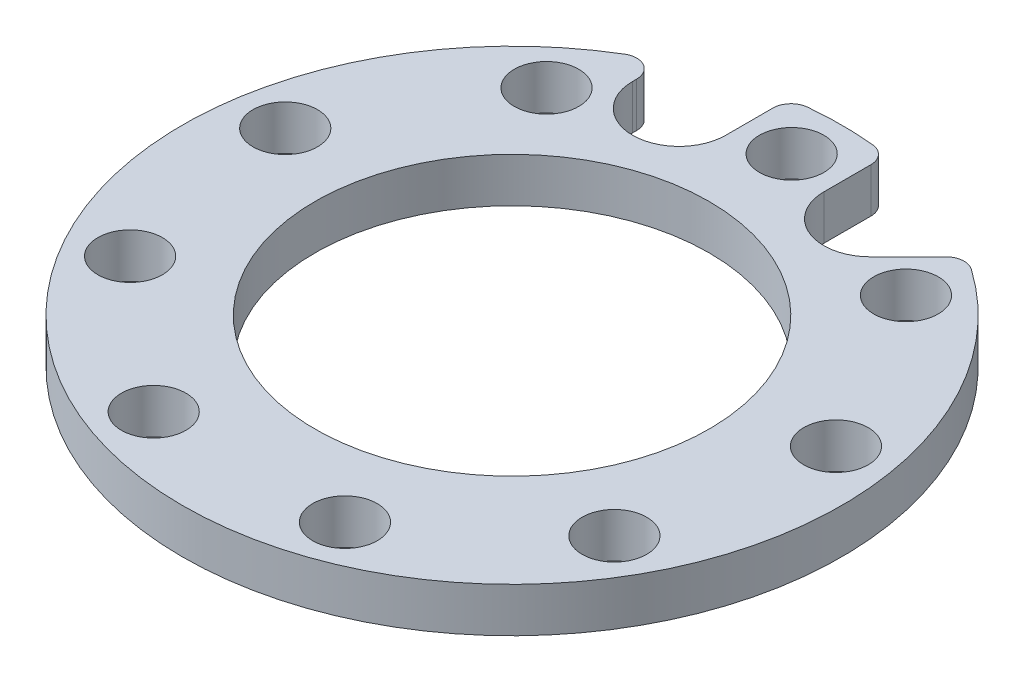
ISO-10303-21;
HEADER;
FILE_DESCRIPTION(('STEP AP214'),'2;1');
FILE_NAME('part.step','',(''),(''),'','','');
FILE_SCHEMA(('AUTOMOTIVE_DESIGN { 1 0 10303 214 1 1 1 1 }'));
ENDSEC;
DATA;
#1=APPLICATION_CONTEXT('core data for automotive mechanical design processes');
#2=APPLICATION_PROTOCOL_DEFINITION('international standard','automotive_design',2000,#1);
#3=PRODUCT_CONTEXT('',#1,'mechanical');
#4=PRODUCT('Part','Part','',(#3));
#5=PRODUCT_RELATED_PRODUCT_CATEGORY('part','',(#4));
#6=PRODUCT_DEFINITION_FORMATION('','',#4);
#7=PRODUCT_DEFINITION_CONTEXT('part definition',#1,'design');
#8=PRODUCT_DEFINITION('design','',#6,#7);
#9=PRODUCT_DEFINITION_SHAPE('','',#8);
#10=(LENGTH_UNIT() NAMED_UNIT(*) SI_UNIT(.MILLI.,.METRE.));
#11=(NAMED_UNIT(*) PLANE_ANGLE_UNIT() SI_UNIT($,.RADIAN.));
#12=(NAMED_UNIT(*) SI_UNIT($,.STERADIAN.) SOLID_ANGLE_UNIT());
#13=UNCERTAINTY_MEASURE_WITH_UNIT(LENGTH_MEASURE(1.E-05),#10,'distance_accuracy_value','');
#14=(GEOMETRIC_REPRESENTATION_CONTEXT(3) GLOBAL_UNCERTAINTY_ASSIGNED_CONTEXT((#13)) GLOBAL_UNIT_ASSIGNED_CONTEXT((#10,
#11,#12)) REPRESENTATION_CONTEXT('',''));
#15=CARTESIAN_POINT('',(0.,0.,0.));
#16=DIRECTION('',(0.,0.,1.));
#17=DIRECTION('',(1.,0.,0.));
#18=AXIS2_PLACEMENT_3D('',#15,#16,#17);
#19=CARTESIAN_POINT('',(0.,6.21400078,0.));
#20=DIRECTION('',(0.,-1.,0.));
#21=DIRECTION('',(0.,0.,-1.));
#22=AXIS2_PLACEMENT_3D('',#19,#20,#21);
#23=CYLINDRICAL_SURFACE('',#22,45.974);
#24=CARTESIAN_POINT('',(0.,6.21400078,0.));
#25=DIRECTION('',(0.,1.,0.));
#26=DIRECTION('',(0.,0.,1.));
#27=AXIS2_PLACEMENT_3D('',#24,#25,#26);
#28=CIRCLE('',#27,45.974);
#29=CARTESIAN_POINT('',(4.55017655985906,6.21400078,-45.7482739485777));
#30=VERTEX_POINT('',#29);
#31=CARTESIAN_POINT('',(-4.55017655985855,6.21400078,-45.7482739485777));
#32=VERTEX_POINT('',#31);
#33=EDGE_CURVE('E195',#30,#32,#28,.T.);
#34=ORIENTED_EDGE('',*,*,#33,.F.);
#35=DIRECTION('',(0.,-1.,0.));
#36=VECTOR('',#35,1.);
#37=CARTESIAN_POINT('',(4.55017655985906,6.21400078,-45.7482739485777));
#38=LINE('',#37,#36);
#39=CARTESIAN_POINT('',(4.55017655985906,0.,-45.7482739485777));
#40=VERTEX_POINT('',#39);
#41=EDGE_CURVE('E243',#30,#40,#38,.T.);
#42=ORIENTED_EDGE('',*,*,#41,.T.);
#43=CARTESIAN_POINT('',(0.,0.,0.));
#44=DIRECTION('',(0.,1.,0.));
#45=DIRECTION('',(0.,0.,1.));
#46=AXIS2_PLACEMENT_3D('',#43,#44,#45);
#47=CIRCLE('',#46,45.974);
#48=CARTESIAN_POINT('',(-4.55017655985855,0.,-45.7482739485777));
#49=VERTEX_POINT('',#48);
#50=EDGE_CURVE('E201',#40,#49,#47,.T.);
#51=ORIENTED_EDGE('',*,*,#50,.T.);
#52=DIRECTION('',(0.,-1.,0.));
#53=VECTOR('',#52,1.);
#54=CARTESIAN_POINT('',(-4.55017655985855,6.21400078,-45.7482739485777));
#55=LINE('',#54,#53);
#56=EDGE_CURVE('E239',#49,#32,#55,.F.);
#57=ORIENTED_EDGE('',*,*,#56,.T.);
#58=EDGE_LOOP('',(#34,#42,#51,#57));
#59=FACE_BOUND('',#58,.T.);
#60=ADVANCED_FACE('F47',(#59),#23,.T.);
#61=CARTESIAN_POINT('',(0.,6.21400078,0.));
#62=DIRECTION('',(0.,1.,0.));
#63=DIRECTION('',(0.,0.,1.));
#64=AXIS2_PLACEMENT_3D('',#61,#62,#63);
#65=PLANE('',#64);
#66=CARTESIAN_POINT('',(-23.687486501379,6.21400078,-39.401924562729));
#67=VERTEX_POINT('',#66);
#68=CARTESIAN_POINT('',(26.4576638960307,6.21400078,-37.5978815515539));
#69=VERTEX_POINT('',#68);
#70=EDGE_CURVE('E200',#67,#69,#28,.T.);
#71=ORIENTED_EDGE('',*,*,#70,.T.);
#72=CARTESIAN_POINT('',(24.9959145095096,6.21400078,-35.5206505266061));
#73=DIRECTION('',(0.,1.,0.));
#74=DIRECTION('',(0.,0.,1.));
#75=AXIS2_PLACEMENT_3D('',#72,#73,#74);
#76=CIRCLE('',#75,2.54);
#77=CARTESIAN_POINT('',(23.1998632852958,6.21400078,-37.31670175082));
#78=VERTEX_POINT('',#77);
#79=EDGE_CURVE('E220',#69,#78,#76,.T.);
#80=ORIENTED_EDGE('',*,*,#79,.T.);
#81=DIRECTION('',(0.707106781186547,0.,-0.707106781186548));
#82=VECTOR('',#81,1.);
#83=CARTESIAN_POINT('',(17.9349796674137,6.21400078,-32.0518181329379));
#84=LINE('',#83,#82);
#85=CARTESIAN_POINT('',(17.9349796674137,6.21400078,-32.0518181329379));
#86=VERTEX_POINT('',#85);
#87=EDGE_CURVE('E289',#86,#78,#84,.T.);
#88=ORIENTED_EDGE('',*,*,#87,.F.);
#89=CARTESIAN_POINT('',(13.3387855897011,6.21400078,-36.6480122106504));
#90=DIRECTION('',(0.,1.,0.));
#91=DIRECTION('',(0.,0.,1.));
#92=AXIS2_PLACEMENT_3D('',#89,#90,#91);
#93=CIRCLE('',#92,6.5);
#94=CARTESIAN_POINT('',(6.83878558970111,6.21400078,-36.6480122106504));
#95=VERTEX_POINT('',#94);
#96=EDGE_CURVE('E167',#95,#86,#93,.T.);
#97=ORIENTED_EDGE('',*,*,#96,.F.);
#98=DIRECTION('',(0.,0.,1.));
#99=VECTOR('',#98,1.);
#100=CARTESIAN_POINT('',(6.83878558970111,6.21400078,-36.6480122106504));
#101=LINE('',#100,#99);
#102=CARTESIAN_POINT('',(6.83878558970111,6.21400078,-43.2207450011424));
#103=VERTEX_POINT('',#102);
#104=EDGE_CURVE('E157',#103,#95,#101,.T.);
#105=ORIENTED_EDGE('',*,*,#104,.F.);
#106=CARTESIAN_POINT('',(4.2987855897011,6.21400078,-43.2207450011424));
#107=DIRECTION('',(0.,1.,0.));
#108=DIRECTION('',(0.,0.,1.));
#109=AXIS2_PLACEMENT_3D('',#106,#107,#108);
#110=CIRCLE('',#109,2.54);
#111=EDGE_CURVE('E217',#103,#30,#110,.T.);
#112=ORIENTED_EDGE('',*,*,#111,.T.);
#113=ORIENTED_EDGE('',*,*,#33,.T.);
#114=CARTESIAN_POINT('',(-4.29878558970062,6.21400078,-43.2207450011425));
#115=DIRECTION('',(0.,1.,0.));
#116=DIRECTION('',(0.,0.,1.));
#117=AXIS2_PLACEMENT_3D('',#114,#115,#116);
#118=CIRCLE('',#117,2.54);
#119=CARTESIAN_POINT('',(-6.83878558970062,6.21400078,-43.2207450011425));
#120=VERTEX_POINT('',#119);
#121=EDGE_CURVE('E214',#32,#120,#118,.T.);
#122=ORIENTED_EDGE('',*,*,#121,.T.);
#123=DIRECTION('',(0.,0.,-1.));
#124=VECTOR('',#123,1.);
#125=CARTESIAN_POINT('',(-6.83878558970062,6.21400078,-36.6480122106506));
#126=LINE('',#125,#124);
#127=CARTESIAN_POINT('',(-6.83878558970062,6.21400078,-36.6480122106506));
#128=VERTEX_POINT('',#127);
#129=EDGE_CURVE('E313',#128,#120,#126,.T.);
#130=ORIENTED_EDGE('',*,*,#129,.F.);
#131=CARTESIAN_POINT('',(-13.3387855897006,6.21400078,-36.6480122106506));
#132=DIRECTION('',(0.,1.,0.));
#133=DIRECTION('',(0.,0.,1.));
#134=AXIS2_PLACEMENT_3D('',#131,#132,#133);
#135=CIRCLE('',#134,6.5);
#136=CARTESIAN_POINT('',(-19.8387855897006,6.21400078,-36.6480122106506));
#137=VERTEX_POINT('',#136);
#138=EDGE_CURVE('E179',#137,#128,#135,.T.);
#139=ORIENTED_EDGE('',*,*,#138,.F.);
#140=DIRECTION('',(0.,0.,1.));
#141=VECTOR('',#140,1.);
#142=CARTESIAN_POINT('',(-19.8387855897006,6.21400078,-36.6480122106506));
#143=LINE('',#142,#141);
#144=CARTESIAN_POINT('',(-19.8387855897006,6.21400078,-37.225022653186));
#145=VERTEX_POINT('',#144);
#146=EDGE_CURVE('E310',#145,#137,#143,.T.);
#147=ORIENTED_EDGE('',*,*,#146,.F.);
#148=CARTESIAN_POINT('',(-22.3787855897006,6.21400078,-37.225022653186));
#149=DIRECTION('',(0.,1.,0.));
#150=DIRECTION('',(0.,0.,1.));
#151=AXIS2_PLACEMENT_3D('',#148,#149,#150);
#152=CIRCLE('',#151,2.54);
#153=EDGE_CURVE('E211',#145,#67,#152,.T.);
#154=ORIENTED_EDGE('',*,*,#153,.T.);
#155=EDGE_LOOP('',(#71,#80,#88,#97,#105,#112,#113,#122,#130,#139,#147,#154));
#156=FACE_BOUND('',#155,.T.);
#157=CARTESIAN_POINT('',(-25.0687167777747,6.21400078,-29.8757332816405));
#158=DIRECTION('',(0.,1.,0.));
#159=DIRECTION('',(0.,0.,1.));
#160=AXIS2_PLACEMENT_3D('',#157,#158,#159);
#161=CIRCLE('',#160,4.49999999999999);
#162=CARTESIAN_POINT('',(-25.0687167777747,6.21400078,-25.3757332816405));
#163=VERTEX_POINT('',#162);
#164=EDGE_CURVE('E162',#163,#163,#161,.T.);
#165=ORIENTED_EDGE('',*,*,#164,.F.);
#166=EDGE_LOOP('',(#165));
#167=FACE_BOUND('',#166,.T.);
#168=CARTESIAN_POINT('',(-38.407502367476,6.21400078,-6.77227892901068));
#169=DIRECTION('',(0.,1.,0.));
#170=DIRECTION('',(0.,0.,1.));
#171=AXIS2_PLACEMENT_3D('',#168,#169,#170);
#172=CIRCLE('',#171,4.49999999999999);
#173=CARTESIAN_POINT('',(-38.407502367476,6.21400078,-2.27227892901069));
#174=VERTEX_POINT('',#173);
#175=EDGE_CURVE('E327',#174,#174,#172,.T.);
#176=ORIENTED_EDGE('',*,*,#175,.F.);
#177=EDGE_LOOP('',(#176));
#178=FACE_BOUND('',#177,.T.);
#179=CARTESIAN_POINT('',(-33.7749907475933,6.21400078,19.4999999999997));
#180=DIRECTION('',(0.,1.,0.));
#181=DIRECTION('',(0.,0.,1.));
#182=AXIS2_PLACEMENT_3D('',#179,#180,#181);
#183=CIRCLE('',#182,4.49999999999999);
#184=CARTESIAN_POINT('',(-33.7749907475933,6.21400078,23.9999999999997));
#185=VERTEX_POINT('',#184);
#186=EDGE_CURVE('E335',#185,#185,#183,.T.);
#187=ORIENTED_EDGE('',*,*,#186,.F.);
#188=EDGE_LOOP('',(#187));
#189=FACE_BOUND('',#188,.T.);
#190=CARTESIAN_POINT('',(-13.3387855897014,6.21400078,36.6480122106503));
#191=DIRECTION('',(0.,1.,0.));
#192=DIRECTION('',(0.,0.,1.));
#193=AXIS2_PLACEMENT_3D('',#190,#191,#192);
#194=CIRCLE('',#193,4.49999999999999);
#195=CARTESIAN_POINT('',(-13.3387855897014,6.21400078,41.1480122106503));
#196=VERTEX_POINT('',#195);
#197=EDGE_CURVE('E343',#196,#196,#194,.T.);
#198=ORIENTED_EDGE('',*,*,#197,.F.);
#199=EDGE_LOOP('',(#198));
#200=FACE_BOUND('',#199,.T.);
#201=CARTESIAN_POINT('',(13.3387855897009,6.21400078,36.6480122106505));
#202=DIRECTION('',(0.,1.,0.));
#203=DIRECTION('',(0.,0.,1.));
#204=AXIS2_PLACEMENT_3D('',#201,#202,#203);
#205=CIRCLE('',#204,4.49999999999999);
#206=CARTESIAN_POINT('',(13.3387855897009,6.21400078,41.1480122106505));
#207=VERTEX_POINT('',#206);
#208=EDGE_CURVE('E351',#207,#207,#205,.T.);
#209=ORIENTED_EDGE('',*,*,#208,.F.);
#210=EDGE_LOOP('',(#209));
#211=FACE_BOUND('',#210,.T.);
#212=CARTESIAN_POINT('',(33.774990747593,6.21400078,19.5000000000002));
#213=DIRECTION('',(0.,1.,0.));
#214=DIRECTION('',(0.,0.,1.));
#215=AXIS2_PLACEMENT_3D('',#212,#213,#214);
#216=CIRCLE('',#215,4.49999999999999);
#217=CARTESIAN_POINT('',(33.774990747593,6.21400078,24.0000000000001));
#218=VERTEX_POINT('',#217);
#219=EDGE_CURVE('E359',#218,#218,#216,.T.);
#220=ORIENTED_EDGE('',*,*,#219,.F.);
#221=EDGE_LOOP('',(#220));
#222=FACE_BOUND('',#221,.T.);
#223=CARTESIAN_POINT('',(38.4075023674761,6.21400078,-6.77227892901017));
#224=DIRECTION('',(0.,1.,0.));
#225=DIRECTION('',(0.,0.,1.));
#226=AXIS2_PLACEMENT_3D('',#223,#224,#225);
#227=CIRCLE('',#226,4.49999999999999);
#228=CARTESIAN_POINT('',(38.4075023674761,6.21400078,-2.27227892901018));
#229=VERTEX_POINT('',#228);
#230=EDGE_CURVE('E367',#229,#229,#227,.T.);
#231=ORIENTED_EDGE('',*,*,#230,.F.);
#232=EDGE_LOOP('',(#231));
#233=FACE_BOUND('',#232,.T.);
#234=CARTESIAN_POINT('',(25.0687167777751,6.21400078,-29.8757332816401));
#235=DIRECTION('',(0.,1.,0.));
#236=DIRECTION('',(0.,0.,1.));
#237=AXIS2_PLACEMENT_3D('',#234,#235,#236);
#238=CIRCLE('',#237,4.49999999999999);
#239=CARTESIAN_POINT('',(25.0687167777751,6.21400078,-25.3757332816401));
#240=VERTEX_POINT('',#239);
#241=EDGE_CURVE('E375',#240,#240,#238,.T.);
#242=ORIENTED_EDGE('',*,*,#241,.F.);
#243=EDGE_LOOP('',(#242));
#244=FACE_BOUND('',#243,.T.);
#245=CARTESIAN_POINT('',(0.,6.21400078,-39.));
#246=DIRECTION('',(0.,1.,0.));
#247=DIRECTION('',(0.,0.,1.));
#248=AXIS2_PLACEMENT_3D('',#245,#246,#247);
#249=CIRCLE('',#248,4.49999999999999);
#250=CARTESIAN_POINT('',(0.,6.21400078,-34.5));
#251=VERTEX_POINT('',#250);
#252=EDGE_CURVE('E176',#251,#251,#249,.T.);
#253=ORIENTED_EDGE('',*,*,#252,.F.);
#254=EDGE_LOOP('',(#253));
#255=FACE_BOUND('',#254,.T.);
#256=CARTESIAN_POINT('',(0.,6.21400078,0.));
#257=DIRECTION('',(0.,1.,0.));
#258=DIRECTION('',(0.,0.,1.));
#259=AXIS2_PLACEMENT_3D('',#256,#257,#258);
#260=CIRCLE('',#259,27.4955);
#261=CARTESIAN_POINT('',(0.,6.21400078,-27.4955));
#262=VERTEX_POINT('',#261);
#263=EDGE_CURVE('E187',#262,#262,#260,.T.);
#264=ORIENTED_EDGE('',*,*,#263,.F.);
#265=EDGE_LOOP('',(#264));
#266=FACE_BOUND('',#265,.T.);
#267=ADVANCED_FACE('F287',(#156,#167,#178,#189,#200,#211,#222,#233,#244,#255,#266),#65,.T.);
#268=CARTESIAN_POINT('',(0.,0.,0.));
#269=DIRECTION('',(0.,1.,0.));
#270=DIRECTION('',(0.,0.,1.));
#271=AXIS2_PLACEMENT_3D('',#268,#269,#270);
#272=PLANE('',#271);
#273=CARTESIAN_POINT('',(-25.0687167777747,0.,-29.8757332816405));
#274=DIRECTION('',(0.,1.,0.));
#275=DIRECTION('',(0.,0.,1.));
#276=AXIS2_PLACEMENT_3D('',#273,#274,#275);
#277=CIRCLE('',#276,4.5);
#278=CARTESIAN_POINT('',(-25.0687167777747,0.,-25.3757332816405));
#279=VERTEX_POINT('',#278);
#280=EDGE_CURVE('E323',#279,#279,#277,.T.);
#281=ORIENTED_EDGE('',*,*,#280,.T.);
#282=EDGE_LOOP('',(#281));
#283=FACE_BOUND('',#282,.T.);
#284=CARTESIAN_POINT('',(-38.407502367476,0.,-6.77227892901068));
#285=DIRECTION('',(0.,1.,0.));
#286=DIRECTION('',(0.,0.,1.));
#287=AXIS2_PLACEMENT_3D('',#284,#285,#286);
#288=CIRCLE('',#287,4.5);
#289=CARTESIAN_POINT('',(-38.407502367476,0.,-2.27227892901068));
#290=VERTEX_POINT('',#289);
#291=EDGE_CURVE('E331',#290,#290,#288,.T.);
#292=ORIENTED_EDGE('',*,*,#291,.T.);
#293=EDGE_LOOP('',(#292));
#294=FACE_BOUND('',#293,.T.);
#295=CARTESIAN_POINT('',(-33.7749907475933,0.,19.4999999999997));
#296=DIRECTION('',(0.,1.,0.));
#297=DIRECTION('',(0.,0.,1.));
#298=AXIS2_PLACEMENT_3D('',#295,#296,#297);
#299=CIRCLE('',#298,4.5);
#300=CARTESIAN_POINT('',(-33.7749907475933,0.,23.9999999999997));
#301=VERTEX_POINT('',#300);
#302=EDGE_CURVE('E339',#301,#301,#299,.T.);
#303=ORIENTED_EDGE('',*,*,#302,.T.);
#304=EDGE_LOOP('',(#303));
#305=FACE_BOUND('',#304,.T.);
#306=CARTESIAN_POINT('',(-13.3387855897014,0.,36.6480122106503));
#307=DIRECTION('',(0.,1.,0.));
#308=DIRECTION('',(0.,0.,1.));
#309=AXIS2_PLACEMENT_3D('',#306,#307,#308);
#310=CIRCLE('',#309,4.5);
#311=CARTESIAN_POINT('',(-13.3387855897014,0.,41.1480122106503));
#312=VERTEX_POINT('',#311);
#313=EDGE_CURVE('E347',#312,#312,#310,.T.);
#314=ORIENTED_EDGE('',*,*,#313,.T.);
#315=EDGE_LOOP('',(#314));
#316=FACE_BOUND('',#315,.T.);
#317=CARTESIAN_POINT('',(13.3387855897009,0.,36.6480122106505));
#318=DIRECTION('',(0.,1.,0.));
#319=DIRECTION('',(0.,0.,1.));
#320=AXIS2_PLACEMENT_3D('',#317,#318,#319);
#321=CIRCLE('',#320,4.5);
#322=CARTESIAN_POINT('',(13.3387855897009,0.,41.1480122106505));
#323=VERTEX_POINT('',#322);
#324=EDGE_CURVE('E355',#323,#323,#321,.T.);
#325=ORIENTED_EDGE('',*,*,#324,.T.);
#326=EDGE_LOOP('',(#325));
#327=FACE_BOUND('',#326,.T.);
#328=CARTESIAN_POINT('',(33.774990747593,0.,19.5000000000002));
#329=DIRECTION('',(0.,1.,0.));
#330=DIRECTION('',(0.,0.,1.));
#331=AXIS2_PLACEMENT_3D('',#328,#329,#330);
#332=CIRCLE('',#331,4.5);
#333=CARTESIAN_POINT('',(33.774990747593,0.,24.0000000000002));
#334=VERTEX_POINT('',#333);
#335=EDGE_CURVE('E363',#334,#334,#332,.T.);
#336=ORIENTED_EDGE('',*,*,#335,.T.);
#337=EDGE_LOOP('',(#336));
#338=FACE_BOUND('',#337,.T.);
#339=CARTESIAN_POINT('',(38.4075023674761,0.,-6.77227892901017));
#340=DIRECTION('',(0.,1.,0.));
#341=DIRECTION('',(0.,0.,1.));
#342=AXIS2_PLACEMENT_3D('',#339,#340,#341);
#343=CIRCLE('',#342,4.5);
#344=CARTESIAN_POINT('',(38.4075023674761,0.,-2.27227892901017));
#345=VERTEX_POINT('',#344);
#346=EDGE_CURVE('E371',#345,#345,#343,.T.);
#347=ORIENTED_EDGE('',*,*,#346,.T.);
#348=EDGE_LOOP('',(#347));
#349=FACE_BOUND('',#348,.T.);
#350=CARTESIAN_POINT('',(25.0687167777751,0.,-29.8757332816401));
#351=DIRECTION('',(0.,1.,0.));
#352=DIRECTION('',(0.,0.,1.));
#353=AXIS2_PLACEMENT_3D('',#350,#351,#352);
#354=CIRCLE('',#353,4.5);
#355=CARTESIAN_POINT('',(25.0687167777751,0.,-25.3757332816401));
#356=VERTEX_POINT('',#355);
#357=EDGE_CURVE('E379',#356,#356,#354,.T.);
#358=ORIENTED_EDGE('',*,*,#357,.T.);
#359=EDGE_LOOP('',(#358));
#360=FACE_BOUND('',#359,.T.);
#361=CARTESIAN_POINT('',(0.,0.,-39.));
#362=DIRECTION('',(0.,1.,0.));
#363=DIRECTION('',(0.,0.,1.));
#364=AXIS2_PLACEMENT_3D('',#361,#362,#363);
#365=CIRCLE('',#364,4.5);
#366=CARTESIAN_POINT('',(0.,0.,-34.5));
#367=VERTEX_POINT('',#366);
#368=EDGE_CURVE('E168',#367,#367,#365,.T.);
#369=ORIENTED_EDGE('',*,*,#368,.T.);
#370=EDGE_LOOP('',(#369));
#371=FACE_BOUND('',#370,.T.);
#372=CARTESIAN_POINT('',(0.,0.,0.));
#373=DIRECTION('',(0.,1.,0.));
#374=DIRECTION('',(0.,0.,1.));
#375=AXIS2_PLACEMENT_3D('',#372,#373,#374);
#376=CIRCLE('',#375,27.4955);
#377=CARTESIAN_POINT('',(0.,0.,-27.4955));
#378=VERTEX_POINT('',#377);
#379=EDGE_CURVE('E183',#378,#378,#376,.T.);
#380=ORIENTED_EDGE('',*,*,#379,.T.);
#381=EDGE_LOOP('',(#380));
#382=FACE_BOUND('',#381,.T.);
#383=DIRECTION('',(0.707106781186547,0.,-0.707106781186548));
#384=VECTOR('',#383,1.);
#385=CARTESIAN_POINT('',(17.9349796674137,0.,-32.0518181329379));
#386=LINE('',#385,#384);
#387=CARTESIAN_POINT('',(17.9349796674137,0.,-32.0518181329379));
#388=VERTEX_POINT('',#387);
#389=CARTESIAN_POINT('',(23.1998632852958,0.,-37.31670175082));
#390=VERTEX_POINT('',#389);
#391=EDGE_CURVE('E151',#388,#390,#386,.T.);
#392=ORIENTED_EDGE('',*,*,#391,.T.);
#393=CARTESIAN_POINT('',(24.9959145095096,0.,-35.5206505266061));
#394=DIRECTION('',(0.,1.,0.));
#395=DIRECTION('',(0.,0.,1.));
#396=AXIS2_PLACEMENT_3D('',#393,#394,#395);
#397=CIRCLE('',#396,2.54);
#398=CARTESIAN_POINT('',(26.4576638960307,0.,-37.5978815515539));
#399=VERTEX_POINT('',#398);
#400=EDGE_CURVE('E233',#390,#399,#397,.F.);
#401=ORIENTED_EDGE('',*,*,#400,.T.);
#402=CARTESIAN_POINT('',(-23.687486501379,0.,-39.401924562729));
#403=VERTEX_POINT('',#402);
#404=EDGE_CURVE('E191',#403,#399,#47,.T.);
#405=ORIENTED_EDGE('',*,*,#404,.F.);
#406=CARTESIAN_POINT('',(-22.3787855897006,0.,-37.225022653186));
#407=DIRECTION('',(0.,1.,0.));
#408=DIRECTION('',(0.,0.,1.));
#409=AXIS2_PLACEMENT_3D('',#406,#407,#408);
#410=CIRCLE('',#409,2.54);
#411=CARTESIAN_POINT('',(-19.8387855897006,0.,-37.225022653186));
#412=VERTEX_POINT('',#411);
#413=EDGE_CURVE('E70',#403,#412,#410,.F.);
#414=ORIENTED_EDGE('',*,*,#413,.T.);
#415=DIRECTION('',(0.,0.,1.));
#416=VECTOR('',#415,1.);
#417=CARTESIAN_POINT('',(-19.8387855897006,0.,-36.6480122106506));
#418=LINE('',#417,#416);
#419=CARTESIAN_POINT('',(-19.8387855897006,0.,-36.6480122106506));
#420=VERTEX_POINT('',#419);
#421=EDGE_CURVE('E309',#412,#420,#418,.T.);
#422=ORIENTED_EDGE('',*,*,#421,.T.);
#423=CARTESIAN_POINT('',(-13.3387855897006,0.,-36.6480122106506));
#424=DIRECTION('',(0.,1.,0.));
#425=DIRECTION('',(0.,0.,1.));
#426=AXIS2_PLACEMENT_3D('',#423,#424,#425);
#427=CIRCLE('',#426,6.5);
#428=CARTESIAN_POINT('',(-6.83878558970062,0.,-36.6480122106506));
#429=VERTEX_POINT('',#428);
#430=EDGE_CURVE('E173',#420,#429,#427,.T.);
#431=ORIENTED_EDGE('',*,*,#430,.T.);
#432=DIRECTION('',(0.,0.,-1.));
#433=VECTOR('',#432,1.);
#434=CARTESIAN_POINT('',(-6.83878558970062,0.,-36.6480122106506));
#435=LINE('',#434,#433);
#436=CARTESIAN_POINT('',(-6.83878558970062,0.,-43.2207450011425));
#437=VERTEX_POINT('',#436);
#438=EDGE_CURVE('E306',#429,#437,#435,.T.);
#439=ORIENTED_EDGE('',*,*,#438,.T.);
#440=CARTESIAN_POINT('',(-4.29878558970062,0.,-43.2207450011425));
#441=DIRECTION('',(0.,1.,0.));
#442=DIRECTION('',(0.,0.,1.));
#443=AXIS2_PLACEMENT_3D('',#440,#441,#442);
#444=CIRCLE('',#443,2.54);
#445=EDGE_CURVE('E228',#437,#49,#444,.F.);
#446=ORIENTED_EDGE('',*,*,#445,.T.);
#447=ORIENTED_EDGE('',*,*,#50,.F.);
#448=CARTESIAN_POINT('',(4.2987855897011,0.,-43.2207450011424));
#449=DIRECTION('',(0.,1.,0.));
#450=DIRECTION('',(0.,0.,1.));
#451=AXIS2_PLACEMENT_3D('',#448,#449,#450);
#452=CIRCLE('',#451,2.54);
#453=CARTESIAN_POINT('',(6.83878558970111,0.,-43.2207450011424));
#454=VERTEX_POINT('',#453);
#455=EDGE_CURVE('E145',#40,#454,#452,.F.);
#456=ORIENTED_EDGE('',*,*,#455,.T.);
#457=DIRECTION('',(0.,0.,1.));
#458=VECTOR('',#457,1.);
#459=CARTESIAN_POINT('',(6.83878558970111,0.,-36.6480122106504));
#460=LINE('',#459,#458);
#461=CARTESIAN_POINT('',(6.83878558970111,0.,-36.6480122106504));
#462=VERTEX_POINT('',#461);
#463=EDGE_CURVE('E137',#454,#462,#460,.T.);
#464=ORIENTED_EDGE('',*,*,#463,.T.);
#465=CARTESIAN_POINT('',(13.3387855897011,0.,-36.6480122106504));
#466=DIRECTION('',(0.,1.,0.));
#467=DIRECTION('',(0.,0.,1.));
#468=AXIS2_PLACEMENT_3D('',#465,#466,#467);
#469=CIRCLE('',#468,6.5);
#470=EDGE_CURVE('E142',#462,#388,#469,.T.);
#471=ORIENTED_EDGE('',*,*,#470,.T.);
#472=EDGE_LOOP('',(#392,#401,#405,#414,#422,#431,#439,#446,#447,#456,#464,#471));
#473=FACE_BOUND('',#472,.T.);
#474=ADVANCED_FACE('F140',(#283,#294,#305,#316,#327,#338,#349,#360,#371,#382,#473),#272,.F.);
#475=ORIENTED_EDGE('',*,*,#404,.T.);
#476=DIRECTION('',(0.,-1.,0.));
#477=VECTOR('',#476,1.);
#478=CARTESIAN_POINT('',(26.4576638960307,6.21400078,-37.5978815515539));
#479=LINE('',#478,#477);
#480=EDGE_CURVE('E207',#399,#69,#479,.F.);
#481=ORIENTED_EDGE('',*,*,#480,.T.);
#482=ORIENTED_EDGE('',*,*,#70,.F.);
#483=DIRECTION('',(0.,-1.,0.));
#484=VECTOR('',#483,1.);
#485=CARTESIAN_POINT('',(-23.687486501379,6.21400078,-39.401924562729));
#486=LINE('',#485,#484);
#487=EDGE_CURVE('E199',#67,#403,#486,.T.);
#488=ORIENTED_EDGE('',*,*,#487,.T.);
#489=EDGE_LOOP('',(#475,#481,#482,#488));
#490=FACE_BOUND('',#489,.T.);
#491=ADVANCED_FACE('F277',(#490),#23,.T.);
#492=CARTESIAN_POINT('',(0.,6.21400078,0.));
#493=DIRECTION('',(0.,-1.,0.));
#494=DIRECTION('',(0.,0.,-1.));
#495=AXIS2_PLACEMENT_3D('',#492,#493,#494);
#496=CYLINDRICAL_SURFACE('',#495,27.4955);
#497=CARTESIAN_POINT('',(0.,6.21400078,-27.4955));
#498=CARTESIAN_POINT('',(0.,6.14927160520833,-27.4955));
#499=CARTESIAN_POINT('',(0.,6.08454243041667,-27.4955));
#500=CARTESIAN_POINT('',(0.,5.95508408083333,-27.4955));
#501=CARTESIAN_POINT('',(0.,5.89035490604167,-27.4955));
#502=CARTESIAN_POINT('',(0.,5.76089655645833,-27.4955));
#503=CARTESIAN_POINT('',(0.,5.69616738166667,-27.4955));
#504=CARTESIAN_POINT('',(0.,5.56670903208333,-27.4955));
#505=CARTESIAN_POINT('',(0.,5.50197985729167,-27.4955));
#506=CARTESIAN_POINT('',(0.,5.37252150770833,-27.4955));
#507=CARTESIAN_POINT('',(0.,5.30779233291667,-27.4955));
#508=CARTESIAN_POINT('',(0.,5.17833398333333,-27.4955));
#509=CARTESIAN_POINT('',(0.,5.11360480854167,-27.4955));
#510=CARTESIAN_POINT('',(0.,4.98414645895833,-27.4955));
#511=CARTESIAN_POINT('',(0.,4.91941728416667,-27.4955));
#512=CARTESIAN_POINT('',(0.,4.78995893458333,-27.4955));
#513=CARTESIAN_POINT('',(0.,4.72522975979167,-27.4955));
#514=CARTESIAN_POINT('',(0.,4.59577141020833,-27.4955));
#515=CARTESIAN_POINT('',(0.,4.53104223541667,-27.4955));
#516=CARTESIAN_POINT('',(0.,4.40158388583333,-27.4955));
#517=CARTESIAN_POINT('',(0.,4.33685471104167,-27.4955));
#518=CARTESIAN_POINT('',(0.,4.20739636145833,-27.4955));
#519=CARTESIAN_POINT('',(0.,4.14266718666667,-27.4955));
#520=CARTESIAN_POINT('',(0.,4.01320883708333,-27.4955));
#521=CARTESIAN_POINT('',(0.,3.94847966229167,-27.4955));
#522=CARTESIAN_POINT('',(0.,3.81902131270833,-27.4955));
#523=CARTESIAN_POINT('',(0.,3.75429213791667,-27.4955));
#524=CARTESIAN_POINT('',(0.,3.62483378833333,-27.4955));
#525=CARTESIAN_POINT('',(0.,3.56010461354167,-27.4955));
#526=CARTESIAN_POINT('',(0.,3.43064626395833,-27.4955));
#527=CARTESIAN_POINT('',(0.,3.36591708916667,-27.4955));
#528=CARTESIAN_POINT('',(0.,3.23645873958333,-27.4955));
#529=CARTESIAN_POINT('',(0.,3.17172956479167,-27.4955));
#530=CARTESIAN_POINT('',(0.,3.04227121520833,-27.4955));
#531=CARTESIAN_POINT('',(0.,2.97754204041667,-27.4955));
#532=CARTESIAN_POINT('',(0.,2.84808369083333,-27.4955));
#533=CARTESIAN_POINT('',(0.,2.78335451604167,-27.4955));
#534=CARTESIAN_POINT('',(0.,2.65389616645833,-27.4955));
#535=CARTESIAN_POINT('',(0.,2.58916699166667,-27.4955));
#536=CARTESIAN_POINT('',(0.,2.45970864208333,-27.4955));
#537=CARTESIAN_POINT('',(0.,2.39497946729167,-27.4955));
#538=CARTESIAN_POINT('',(0.,2.26552111770833,-27.4955));
#539=CARTESIAN_POINT('',(0.,2.20079194291667,-27.4955));
#540=CARTESIAN_POINT('',(0.,2.07133359333333,-27.4955));
#541=CARTESIAN_POINT('',(0.,2.00660441854167,-27.4955));
#542=CARTESIAN_POINT('',(0.,1.87714606895833,-27.4955));
#543=CARTESIAN_POINT('',(0.,1.81241689416667,-27.4955));
#544=CARTESIAN_POINT('',(0.,1.68295854458333,-27.4955));
#545=CARTESIAN_POINT('',(0.,1.61822936979167,-27.4955));
#546=CARTESIAN_POINT('',(0.,1.48877102020833,-27.4955));
#547=CARTESIAN_POINT('',(0.,1.42404184541667,-27.4955));
#548=CARTESIAN_POINT('',(0.,1.29458349583333,-27.4955));
#549=CARTESIAN_POINT('',(0.,1.22985432104167,-27.4955));
#550=CARTESIAN_POINT('',(0.,1.10039597145833,-27.4955));
#551=CARTESIAN_POINT('',(0.,1.03566679666667,-27.4955));
#552=CARTESIAN_POINT('',(0.,0.906208447083332,-27.4955));
#553=CARTESIAN_POINT('',(0.,0.841479272291666,-27.4955));
#554=CARTESIAN_POINT('',(0.,0.712020922708332,-27.4955));
#555=CARTESIAN_POINT('',(0.,0.647291747916666,-27.4955));
#556=CARTESIAN_POINT('',(0.,0.517833398333332,-27.4955));
#557=CARTESIAN_POINT('',(0.,0.453104223541666,-27.4955));
#558=CARTESIAN_POINT('',(0.,0.323645873958333,-27.4955));
#559=CARTESIAN_POINT('',(0.,0.258916699166666,-27.4955));
#560=CARTESIAN_POINT('',(0.,0.129458349583333,-27.4955));
#561=CARTESIAN_POINT('',(0.,0.0647291747916659,-27.4955));
#562=CARTESIAN_POINT('',(0.,0.,-27.4955));
#563=B_SPLINE_CURVE_WITH_KNOTS('',3,(#497,#498,#499,#500,#501,#502,#503,#504,#505,#506,#507,
#508,#509,#510,#511,#512,#513,#514,#515,#516,#517,#518,#519,#520,#521,#522,#523,#524,#525,#526,
#527,#528,#529,#530,#531,#532,#533,#534,#535,#536,#537,#538,#539,#540,#541,#542,#543,#544,#545,
#546,#547,#548,#549,#550,#551,#552,#553,#554,#555,#556,#557,#558,#559,#560,#561,#562),
.UNSPECIFIED.,.F.,.F.,(4,2,2,2,2,2,2,2,2,2,2,2,2,2,2,2,2,2,2,2,2,2,2,2,2,2,2,2,2,2,2,2,4),(0.,
0.194187524375,0.38837504875,0.582562573125001,0.776750097500001,0.970937621875,1.16512514625,
1.359312670625,1.553500195,1.747687719375,1.94187524375,2.136062768125,2.3302502925,
2.524437816875,2.71862534125,2.912812865625,3.10700039,3.301187914375,3.49537543875,
3.689562963125,3.8837504875,4.077938011875,4.27212553625,4.466313060625,4.660500585,
4.854688109375,5.04887563375,5.243063158125,5.4372506825,5.631438206875,5.82562573125,
6.019813255625,6.21400078),.UNSPECIFIED.);
#564=EDGE_CURVE('BSEAM395',#262,#378,#563,.T.);
#565=ORIENTED_EDGE('',*,*,#263,.T.);
#566=ORIENTED_EDGE('',*,*,#379,.F.);
#567=ORIENTED_EDGE('',*,*,#564,.T.);
#568=ORIENTED_EDGE('',*,*,#564,.F.);
#569=EDGE_LOOP('',(#565,#567,#566,#568));
#570=FACE_BOUND('',#569,.T.);
#571=ADVANCED_FACE('F395',(#570),#496,.F.);
#572=CARTESIAN_POINT('',(-13.3387855897006,6.21400078,-36.6480122106506));
#573=DIRECTION('',(0.,-1.,0.));
#574=DIRECTION('',(0.,0.,-1.));
#575=AXIS2_PLACEMENT_3D('',#572,#573,#574);
#576=CYLINDRICAL_SURFACE('',#575,6.5);
#577=DIRECTION('',(0.,1.,0.));
#578=VECTOR('',#577,1.);
#579=CARTESIAN_POINT('',(-19.8387855897006,0.,-36.6480122106506));
#580=LINE('',#579,#578);
#581=EDGE_CURVE('E293',#420,#137,#580,.T.);
#582=ORIENTED_EDGE('',*,*,#581,.T.);
#583=ORIENTED_EDGE('',*,*,#138,.T.);
#584=DIRECTION('',(0.,1.,0.));
#585=VECTOR('',#584,1.);
#586=CARTESIAN_POINT('',(-6.83878558970062,0.,-36.6480122106506));
#587=LINE('',#586,#585);
#588=EDGE_CURVE('E300',#429,#128,#587,.T.);
#589=ORIENTED_EDGE('',*,*,#588,.F.);
#590=ORIENTED_EDGE('',*,*,#430,.F.);
#591=EDGE_LOOP('',(#582,#583,#589,#590));
#592=FACE_BOUND('',#591,.T.);
#593=ADVANCED_FACE('F398',(#592),#576,.F.);
#594=CARTESIAN_POINT('',(13.3387855897011,6.21400078,-36.6480122106504));
#595=DIRECTION('',(0.,-1.,0.));
#596=DIRECTION('',(0.,0.,-1.));
#597=AXIS2_PLACEMENT_3D('',#594,#595,#596);
#598=CYLINDRICAL_SURFACE('',#597,6.5);
#599=DIRECTION('',(0.,1.,0.));
#600=VECTOR('',#599,1.);
#601=CARTESIAN_POINT('',(6.83878558970111,0.,-36.6480122106504));
#602=LINE('',#601,#600);
#603=EDGE_CURVE('E154',#462,#95,#602,.T.);
#604=ORIENTED_EDGE('',*,*,#603,.T.);
#605=ORIENTED_EDGE('',*,*,#96,.T.);
#606=DIRECTION('',(0.,1.,0.));
#607=VECTOR('',#606,1.);
#608=CARTESIAN_POINT('',(17.9349796674137,0.,-32.0518181329379));
#609=LINE('',#608,#607);
#610=EDGE_CURVE('E150',#388,#86,#609,.T.);
#611=ORIENTED_EDGE('',*,*,#610,.F.);
#612=ORIENTED_EDGE('',*,*,#470,.F.);
#613=EDGE_LOOP('',(#604,#605,#611,#612));
#614=FACE_BOUND('',#613,.T.);
#615=ADVANCED_FACE('F165',(#614),#598,.F.);
#616=CARTESIAN_POINT('',(0.,6.21400078,-39.));
#617=DIRECTION('',(0.,1.,0.));
#618=DIRECTION('',(0.,0.,1.));
#619=AXIS2_PLACEMENT_3D('',#616,#617,#618);
#620=CYLINDRICAL_SURFACE('',#619,4.49999999999999);
#621=ORIENTED_EDGE('',*,*,#368,.F.);
#622=EDGE_LOOP('',(#621));
#623=FACE_BOUND('',#622,.T.);
#624=ORIENTED_EDGE('',*,*,#252,.T.);
#625=EDGE_LOOP('',(#624));
#626=FACE_BOUND('',#625,.T.);
#627=ADVANCED_FACE('F388',(#623,#626),#620,.F.);
#628=CARTESIAN_POINT('',(25.0687167777751,6.21400078,-29.8757332816401));
#629=DIRECTION('',(0.,1.,0.));
#630=DIRECTION('',(0.,0.,1.));
#631=AXIS2_PLACEMENT_3D('',#628,#629,#630);
#632=CYLINDRICAL_SURFACE('',#631,4.49999999999999);
#633=ORIENTED_EDGE('',*,*,#357,.F.);
#634=EDGE_LOOP('',(#633));
#635=FACE_BOUND('',#634,.T.);
#636=ORIENTED_EDGE('',*,*,#241,.T.);
#637=EDGE_LOOP('',(#636));
#638=FACE_BOUND('',#637,.T.);
#639=ADVANCED_FACE('F478',(#635,#638),#632,.F.);
#640=CARTESIAN_POINT('',(38.4075023674761,6.21400078,-6.77227892901017));
#641=DIRECTION('',(0.,1.,0.));
#642=DIRECTION('',(0.,0.,1.));
#643=AXIS2_PLACEMENT_3D('',#640,#641,#642);
#644=CYLINDRICAL_SURFACE('',#643,4.49999999999999);
#645=ORIENTED_EDGE('',*,*,#346,.F.);
#646=EDGE_LOOP('',(#645));
#647=FACE_BOUND('',#646,.T.);
#648=ORIENTED_EDGE('',*,*,#230,.T.);
#649=EDGE_LOOP('',(#648));
#650=FACE_BOUND('',#649,.T.);
#651=ADVANCED_FACE('F474',(#647,#650),#644,.F.);
#652=CARTESIAN_POINT('',(33.774990747593,6.21400078,19.5000000000002));
#653=DIRECTION('',(0.,1.,0.));
#654=DIRECTION('',(0.,0.,1.));
#655=AXIS2_PLACEMENT_3D('',#652,#653,#654);
#656=CYLINDRICAL_SURFACE('',#655,4.49999999999999);
#657=ORIENTED_EDGE('',*,*,#335,.F.);
#658=EDGE_LOOP('',(#657));
#659=FACE_BOUND('',#658,.T.);
#660=ORIENTED_EDGE('',*,*,#219,.T.);
#661=EDGE_LOOP('',(#660));
#662=FACE_BOUND('',#661,.T.);
#663=ADVANCED_FACE('F470',(#659,#662),#656,.F.);
#664=CARTESIAN_POINT('',(13.3387855897009,6.21400078,36.6480122106505));
#665=DIRECTION('',(0.,1.,0.));
#666=DIRECTION('',(0.,0.,1.));
#667=AXIS2_PLACEMENT_3D('',#664,#665,#666);
#668=CYLINDRICAL_SURFACE('',#667,4.49999999999999);
#669=ORIENTED_EDGE('',*,*,#324,.F.);
#670=EDGE_LOOP('',(#669));
#671=FACE_BOUND('',#670,.T.);
#672=ORIENTED_EDGE('',*,*,#208,.T.);
#673=EDGE_LOOP('',(#672));
#674=FACE_BOUND('',#673,.T.);
#675=ADVANCED_FACE('F466',(#671,#674),#668,.F.);
#676=CARTESIAN_POINT('',(-13.3387855897014,6.21400078,36.6480122106503));
#677=DIRECTION('',(0.,1.,0.));
#678=DIRECTION('',(0.,0.,1.));
#679=AXIS2_PLACEMENT_3D('',#676,#677,#678);
#680=CYLINDRICAL_SURFACE('',#679,4.49999999999999);
#681=ORIENTED_EDGE('',*,*,#313,.F.);
#682=EDGE_LOOP('',(#681));
#683=FACE_BOUND('',#682,.T.);
#684=ORIENTED_EDGE('',*,*,#197,.T.);
#685=EDGE_LOOP('',(#684));
#686=FACE_BOUND('',#685,.T.);
#687=ADVANCED_FACE('F462',(#683,#686),#680,.F.);
#688=CARTESIAN_POINT('',(-33.7749907475933,6.21400078,19.4999999999997));
#689=DIRECTION('',(0.,1.,0.));
#690=DIRECTION('',(0.,0.,1.));
#691=AXIS2_PLACEMENT_3D('',#688,#689,#690);
#692=CYLINDRICAL_SURFACE('',#691,4.49999999999999);
#693=ORIENTED_EDGE('',*,*,#302,.F.);
#694=EDGE_LOOP('',(#693));
#695=FACE_BOUND('',#694,.T.);
#696=ORIENTED_EDGE('',*,*,#186,.T.);
#697=EDGE_LOOP('',(#696));
#698=FACE_BOUND('',#697,.T.);
#699=ADVANCED_FACE('F458',(#695,#698),#692,.F.);
#700=CARTESIAN_POINT('',(-38.407502367476,6.21400078,-6.77227892901068));
#701=DIRECTION('',(0.,1.,0.));
#702=DIRECTION('',(0.,0.,1.));
#703=AXIS2_PLACEMENT_3D('',#700,#701,#702);
#704=CYLINDRICAL_SURFACE('',#703,4.49999999999999);
#705=ORIENTED_EDGE('',*,*,#291,.F.);
#706=EDGE_LOOP('',(#705));
#707=FACE_BOUND('',#706,.T.);
#708=ORIENTED_EDGE('',*,*,#175,.T.);
#709=EDGE_LOOP('',(#708));
#710=FACE_BOUND('',#709,.T.);
#711=ADVANCED_FACE('F454',(#707,#710),#704,.F.);
#712=CARTESIAN_POINT('',(-25.0687167777747,6.21400078,-29.8757332816405));
#713=DIRECTION('',(0.,1.,0.));
#714=DIRECTION('',(0.,0.,1.));
#715=AXIS2_PLACEMENT_3D('',#712,#713,#714);
#716=CYLINDRICAL_SURFACE('',#715,4.49999999999999);
#717=ORIENTED_EDGE('',*,*,#280,.F.);
#718=EDGE_LOOP('',(#717));
#719=FACE_BOUND('',#718,.T.);
#720=ORIENTED_EDGE('',*,*,#164,.T.);
#721=EDGE_LOOP('',(#720));
#722=FACE_BOUND('',#721,.T.);
#723=ADVANCED_FACE('F451',(#719,#722),#716,.F.);
#724=CARTESIAN_POINT('',(17.9349796674137,0.,-32.0518181329379));
#725=DIRECTION('',(0.707106781186548,0.,0.707106781186547));
#726=DIRECTION('',(0.707106781186547,0.,-0.707106781186548));
#727=AXIS2_PLACEMENT_3D('',#724,#725,#726);
#728=PLANE('',#727);
#729=ORIENTED_EDGE('',*,*,#87,.T.);
#730=DIRECTION('',(0.,-1.,0.));
#731=VECTOR('',#730,1.);
#732=CARTESIAN_POINT('',(23.1998632852958,0.,-37.31670175082));
#733=LINE('',#732,#731);
#734=EDGE_CURVE('E223',#78,#390,#733,.T.);
#735=ORIENTED_EDGE('',*,*,#734,.T.);
#736=ORIENTED_EDGE('',*,*,#391,.F.);
#737=ORIENTED_EDGE('',*,*,#610,.T.);
#738=EDGE_LOOP('',(#729,#735,#736,#737));
#739=FACE_BOUND('',#738,.T.);
#740=ADVANCED_FACE('F291',(#739),#728,.F.);
#741=CARTESIAN_POINT('',(6.83878558970111,0.,-36.6480122106504));
#742=DIRECTION('',(-1.,0.,0.));
#743=DIRECTION('',(0.,0.,1.));
#744=AXIS2_PLACEMENT_3D('',#741,#742,#743);
#745=PLANE('',#744);
#746=ORIENTED_EDGE('',*,*,#463,.F.);
#747=DIRECTION('',(0.,-1.,0.));
#748=VECTOR('',#747,1.);
#749=CARTESIAN_POINT('',(6.83878558970111,0.,-43.2207450011424));
#750=LINE('',#749,#748);
#751=EDGE_CURVE('E236',#454,#103,#750,.F.);
#752=ORIENTED_EDGE('',*,*,#751,.T.);
#753=ORIENTED_EDGE('',*,*,#104,.T.);
#754=ORIENTED_EDGE('',*,*,#603,.F.);
#755=EDGE_LOOP('',(#746,#752,#753,#754));
#756=FACE_BOUND('',#755,.T.);
#757=ADVANCED_FACE('F155',(#756),#745,.F.);
#758=CARTESIAN_POINT('',(-6.83878558970062,0.,-36.6480122106506));
#759=DIRECTION('',(1.,0.,0.));
#760=DIRECTION('',(0.,0.,-1.));
#761=AXIS2_PLACEMENT_3D('',#758,#759,#760);
#762=PLANE('',#761);
#763=ORIENTED_EDGE('',*,*,#129,.T.);
#764=DIRECTION('',(0.,-1.,0.));
#765=VECTOR('',#764,1.);
#766=CARTESIAN_POINT('',(-6.83878558970062,0.,-43.2207450011425));
#767=LINE('',#766,#765);
#768=EDGE_CURVE('E56',#120,#437,#767,.T.);
#769=ORIENTED_EDGE('',*,*,#768,.T.);
#770=ORIENTED_EDGE('',*,*,#438,.F.);
#771=ORIENTED_EDGE('',*,*,#588,.T.);
#772=EDGE_LOOP('',(#763,#769,#770,#771));
#773=FACE_BOUND('',#772,.T.);
#774=ADVANCED_FACE('F434',(#773),#762,.F.);
#775=CARTESIAN_POINT('',(-19.8387855897006,0.,-36.6480122106506));
#776=DIRECTION('',(-1.,0.,0.));
#777=DIRECTION('',(0.,0.,1.));
#778=AXIS2_PLACEMENT_3D('',#775,#776,#777);
#779=PLANE('',#778);
#780=ORIENTED_EDGE('',*,*,#421,.F.);
#781=DIRECTION('',(0.,-1.,0.));
#782=VECTOR('',#781,1.);
#783=CARTESIAN_POINT('',(-19.8387855897006,0.,-37.225022653186));
#784=LINE('',#783,#782);
#785=EDGE_CURVE('E11',#412,#145,#784,.F.);
#786=ORIENTED_EDGE('',*,*,#785,.T.);
#787=ORIENTED_EDGE('',*,*,#146,.T.);
#788=ORIENTED_EDGE('',*,*,#581,.F.);
#789=EDGE_LOOP('',(#780,#786,#787,#788));
#790=FACE_BOUND('',#789,.T.);
#791=ADVANCED_FACE('F419',(#790),#779,.F.);
#792=CARTESIAN_POINT('',(24.9959145095096,6.21400078,-35.5206505266061));
#793=DIRECTION('',(0.,-1.,0.));
#794=DIRECTION('',(0.,0.,-1.));
#795=AXIS2_PLACEMENT_3D('',#792,#793,#794);
#796=CYLINDRICAL_SURFACE('',#795,2.54);
#797=ORIENTED_EDGE('',*,*,#400,.F.);
#798=ORIENTED_EDGE('',*,*,#734,.F.);
#799=ORIENTED_EDGE('',*,*,#79,.F.);
#800=ORIENTED_EDGE('',*,*,#480,.F.);
#801=EDGE_LOOP('',(#797,#798,#799,#800));
#802=FACE_BOUND('',#801,.T.);
#803=ADVANCED_FACE('F282',(#802),#796,.T.);
#804=CARTESIAN_POINT('',(4.2987855897011,6.21400078,-43.2207450011424));
#805=DIRECTION('',(0.,-1.,0.));
#806=DIRECTION('',(0.,0.,-1.));
#807=AXIS2_PLACEMENT_3D('',#804,#805,#806);
#808=CYLINDRICAL_SURFACE('',#807,2.54);
#809=ORIENTED_EDGE('',*,*,#455,.F.);
#810=ORIENTED_EDGE('',*,*,#41,.F.);
#811=ORIENTED_EDGE('',*,*,#111,.F.);
#812=ORIENTED_EDGE('',*,*,#751,.F.);
#813=EDGE_LOOP('',(#809,#810,#811,#812));
#814=FACE_BOUND('',#813,.T.);
#815=ADVANCED_FACE('F418',(#814),#808,.T.);
#816=CARTESIAN_POINT('',(-4.29878558970062,6.21400078,-43.2207450011425));
#817=DIRECTION('',(0.,-1.,0.));
#818=DIRECTION('',(0.,0.,-1.));
#819=AXIS2_PLACEMENT_3D('',#816,#817,#818);
#820=CYLINDRICAL_SURFACE('',#819,2.54);
#821=ORIENTED_EDGE('',*,*,#445,.F.);
#822=ORIENTED_EDGE('',*,*,#768,.F.);
#823=ORIENTED_EDGE('',*,*,#121,.F.);
#824=ORIENTED_EDGE('',*,*,#56,.F.);
#825=EDGE_LOOP('',(#821,#822,#823,#824));
#826=FACE_BOUND('',#825,.T.);
#827=ADVANCED_FACE('F421',(#826),#820,.T.);
#828=CARTESIAN_POINT('',(-22.3787855897006,6.21400078,-37.225022653186));
#829=DIRECTION('',(0.,-1.,0.));
#830=DIRECTION('',(0.,0.,-1.));
#831=AXIS2_PLACEMENT_3D('',#828,#829,#830);
#832=CYLINDRICAL_SURFACE('',#831,2.54);
#833=ORIENTED_EDGE('',*,*,#413,.F.);
#834=ORIENTED_EDGE('',*,*,#487,.F.);
#835=ORIENTED_EDGE('',*,*,#153,.F.);
#836=ORIENTED_EDGE('',*,*,#785,.F.);
#837=EDGE_LOOP('',(#833,#834,#835,#836));
#838=FACE_BOUND('',#837,.T.);
#839=ADVANCED_FACE('F49',(#838),#832,.T.);
#840=CLOSED_SHELL('',(#60,#267,#474,#491,#571,#593,#615,#627,#639,#651,#663,#675,#687,#699,#711,
#723,#740,#757,#774,#791,#803,#815,#827,#839));
#841=MANIFOLD_SOLID_BREP('B2',#840);
#842=ADVANCED_BREP_SHAPE_REPRESENTATION('',(#18,#841),#14);
#843=SHAPE_DEFINITION_REPRESENTATION(#9,#842);
ENDSEC;
END-ISO-10303-21;
